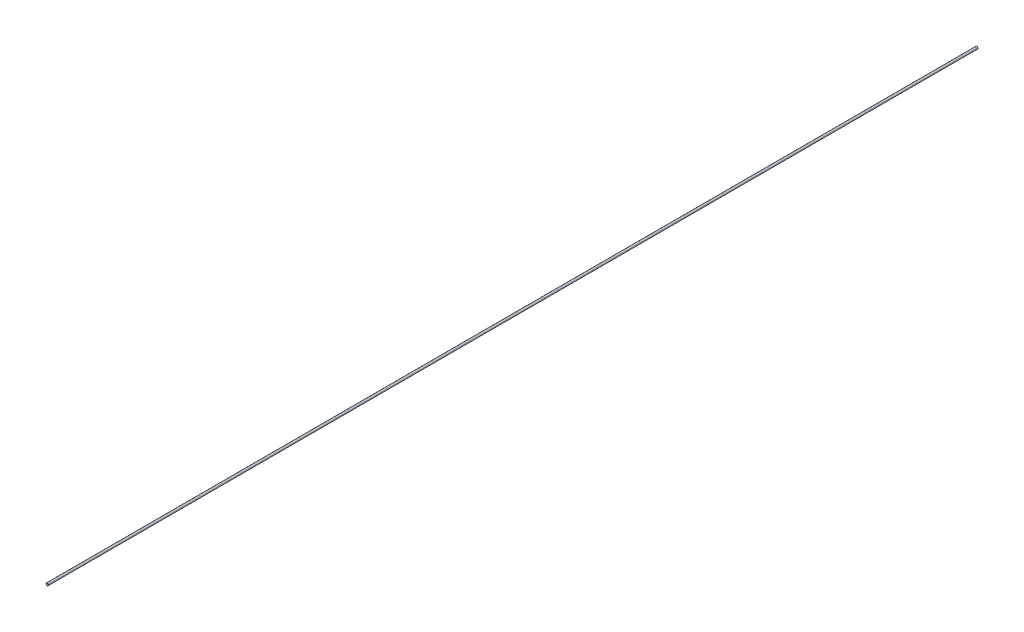
ISO-10303-21;
HEADER;
FILE_DESCRIPTION(('STEP AP214'),'2;1');
FILE_NAME('part.step','',(''),(''),'','','');
FILE_SCHEMA(('AUTOMOTIVE_DESIGN { 1 0 10303 214 1 1 1 1 }'));
ENDSEC;
DATA;
#1=APPLICATION_CONTEXT('core data for automotive mechanical design processes');
#2=APPLICATION_PROTOCOL_DEFINITION('international standard','automotive_design',2000,#1);
#3=PRODUCT_CONTEXT('',#1,'mechanical');
#4=PRODUCT('Part','Part','',(#3));
#5=PRODUCT_RELATED_PRODUCT_CATEGORY('part','',(#4));
#6=PRODUCT_DEFINITION_FORMATION('','',#4);
#7=PRODUCT_DEFINITION_CONTEXT('part definition',#1,'design');
#8=PRODUCT_DEFINITION('design','',#6,#7);
#9=PRODUCT_DEFINITION_SHAPE('','',#8);
#10=(LENGTH_UNIT() NAMED_UNIT(*) SI_UNIT(.MILLI.,.METRE.));
#11=(NAMED_UNIT(*) PLANE_ANGLE_UNIT() SI_UNIT($,.RADIAN.));
#12=(NAMED_UNIT(*) SI_UNIT($,.STERADIAN.) SOLID_ANGLE_UNIT());
#13=UNCERTAINTY_MEASURE_WITH_UNIT(LENGTH_MEASURE(1.E-05),#10,'distance_accuracy_value','');
#14=(GEOMETRIC_REPRESENTATION_CONTEXT(3) GLOBAL_UNCERTAINTY_ASSIGNED_CONTEXT((#13)) GLOBAL_UNIT_ASSIGNED_CONTEXT((#10,
#11,#12)) REPRESENTATION_CONTEXT('',''));
#15=CARTESIAN_POINT('',(0.,0.,0.));
#16=DIRECTION('',(0.,0.,1.));
#17=DIRECTION('',(1.,0.,0.));
#18=AXIS2_PLACEMENT_3D('',#15,#16,#17);
#19=CARTESIAN_POINT('',(0.,0.,-20519.0880174465));
#20=DIRECTION('',(0.,0.,1.));
#21=DIRECTION('',(1.,0.,0.));
#22=AXIS2_PLACEMENT_3D('',#19,#20,#21);
#23=CYLINDRICAL_SURFACE('',#22,25.4);
#24=CARTESIAN_POINT('',(0.,0.,-20519.0880174465));
#25=DIRECTION('',(0.,0.,1.));
#26=DIRECTION('',(1.,0.,0.));
#27=AXIS2_PLACEMENT_3D('',#24,#25,#26);
#28=CIRCLE('',#27,25.4);
#29=CARTESIAN_POINT('',(25.4,0.,-20519.0880174465));
#30=VERTEX_POINT('',#29);
#31=EDGE_CURVE('E10',#30,#30,#28,.T.);
#32=ORIENTED_EDGE('',*,*,#31,.T.);
#33=EDGE_LOOP('',(#32));
#34=FACE_BOUND('',#33,.T.);
#35=CARTESIAN_POINT('',(0.,0.,0.));
#36=DIRECTION('',(0.,0.,1.));
#37=DIRECTION('',(1.,0.,0.));
#38=AXIS2_PLACEMENT_3D('',#35,#36,#37);
#39=CIRCLE('',#38,25.4);
#40=CARTESIAN_POINT('',(25.4,0.,0.));
#41=VERTEX_POINT('',#40);
#42=EDGE_CURVE('E45',#41,#41,#39,.T.);
#43=ORIENTED_EDGE('',*,*,#42,.F.);
#44=EDGE_LOOP('',(#43));
#45=FACE_BOUND('',#44,.T.);
#46=ADVANCED_FACE('F39',(#34,#45),#23,.T.);
#47=CARTESIAN_POINT('',(0.,0.,-20519.0880174465));
#48=DIRECTION('',(0.,0.,1.));
#49=DIRECTION('',(1.,0.,0.));
#50=AXIS2_PLACEMENT_3D('',#47,#48,#49);
#51=PLANE('',#50);
#52=ORIENTED_EDGE('',*,*,#31,.F.);
#53=EDGE_LOOP('',(#52));
#54=FACE_BOUND('',#53,.T.);
#55=ADVANCED_FACE('F53',(#54),#51,.F.);
#56=CARTESIAN_POINT('',(0.,0.,0.));
#57=DIRECTION('',(0.,0.,1.));
#58=DIRECTION('',(1.,0.,0.));
#59=AXIS2_PLACEMENT_3D('',#56,#57,#58);
#60=PLANE('',#59);
#61=ORIENTED_EDGE('',*,*,#42,.T.);
#62=EDGE_LOOP('',(#61));
#63=FACE_BOUND('',#62,.T.);
#64=ADVANCED_FACE('F51',(#63),#60,.T.);
#65=CLOSED_SHELL('',(#46,#55,#64));
#66=MANIFOLD_SOLID_BREP('B2',#65);
#67=ADVANCED_BREP_SHAPE_REPRESENTATION('',(#18,#66),#14);
#68=SHAPE_DEFINITION_REPRESENTATION(#9,#67);
ENDSEC;
END-ISO-10303-21;
